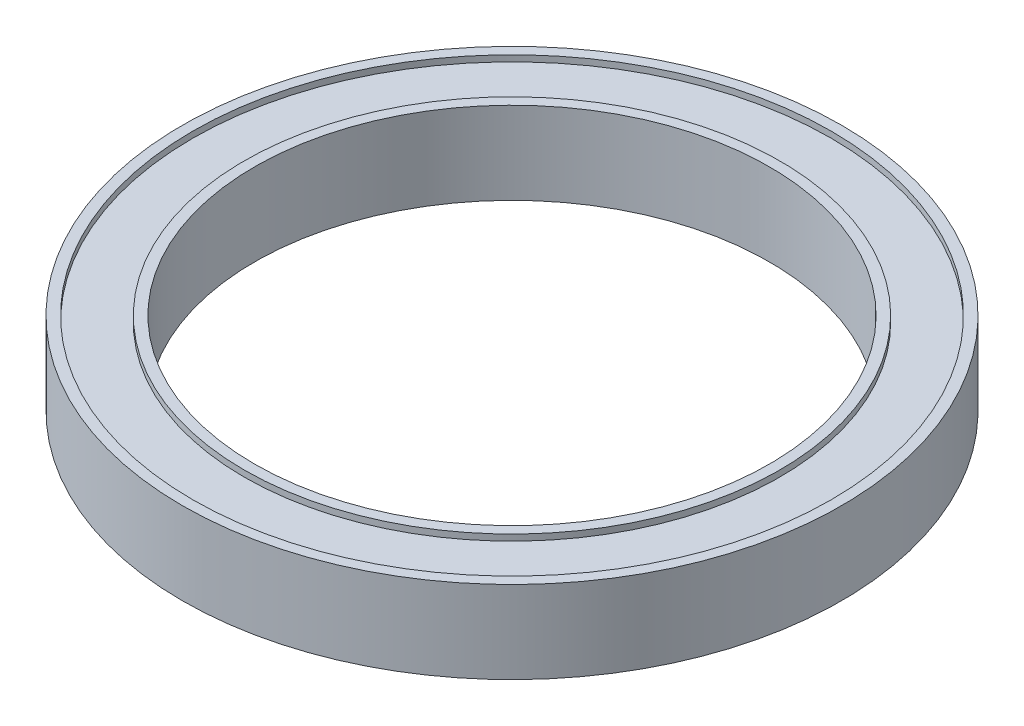
ISO-10303-21;
HEADER;
FILE_DESCRIPTION(('STEP AP214'),'2;1');
FILE_NAME('part.step','',(''),(''),'','','');
FILE_SCHEMA(('AUTOMOTIVE_DESIGN { 1 0 10303 214 1 1 1 1 }'));
ENDSEC;
DATA;
#1=APPLICATION_CONTEXT('core data for automotive mechanical design processes');
#2=APPLICATION_PROTOCOL_DEFINITION('international standard','automotive_design',2000,#1);
#3=PRODUCT_CONTEXT('',#1,'mechanical');
#4=PRODUCT('Part','Part','',(#3));
#5=PRODUCT_RELATED_PRODUCT_CATEGORY('part','',(#4));
#6=PRODUCT_DEFINITION_FORMATION('','',#4);
#7=PRODUCT_DEFINITION_CONTEXT('part definition',#1,'design');
#8=PRODUCT_DEFINITION('design','',#6,#7);
#9=PRODUCT_DEFINITION_SHAPE('','',#8);
#10=(LENGTH_UNIT() NAMED_UNIT(*) SI_UNIT(.MILLI.,.METRE.));
#11=(NAMED_UNIT(*) PLANE_ANGLE_UNIT() SI_UNIT($,.RADIAN.));
#12=(NAMED_UNIT(*) SI_UNIT($,.STERADIAN.) SOLID_ANGLE_UNIT());
#13=UNCERTAINTY_MEASURE_WITH_UNIT(LENGTH_MEASURE(1.E-05),#10,'distance_accuracy_value','');
#14=(GEOMETRIC_REPRESENTATION_CONTEXT(3) GLOBAL_UNCERTAINTY_ASSIGNED_CONTEXT((#13)) GLOBAL_UNIT_ASSIGNED_CONTEXT((#10,
#11,#12)) REPRESENTATION_CONTEXT('',''));
#15=CARTESIAN_POINT('',(0.,0.,0.));
#16=DIRECTION('',(0.,0.,1.));
#17=DIRECTION('',(1.,0.,0.));
#18=AXIS2_PLACEMENT_3D('',#15,#16,#17);
#19=CARTESIAN_POINT('',(0.,0.,0.));
#20=DIRECTION('',(0.,1.,0.));
#21=DIRECTION('',(0.,0.,1.));
#22=AXIS2_PLACEMENT_3D('',#19,#20,#21);
#23=PLANE('',#22);
#24=CARTESIAN_POINT('',(0.,0.,0.));
#25=DIRECTION('',(0.,1.,0.));
#26=DIRECTION('',(0.,0.,1.));
#27=AXIS2_PLACEMENT_3D('',#24,#25,#26);
#28=CIRCLE('',#27,12.5);
#29=CARTESIAN_POINT('',(0.,0.,12.5));
#30=VERTEX_POINT('',#29);
#31=EDGE_CURVE('E52',#30,#30,#28,.T.);
#32=ORIENTED_EDGE('',*,*,#31,.T.);
#33=EDGE_LOOP('',(#32));
#34=FACE_BOUND('',#33,.T.);
#35=CARTESIAN_POINT('',(0.,0.,0.));
#36=DIRECTION('',(0.,1.,0.));
#37=DIRECTION('',(0.,0.,1.));
#38=AXIS2_PLACEMENT_3D('',#35,#36,#37);
#39=CIRCLE('',#38,13.);
#40=CARTESIAN_POINT('',(0.,0.,13.));
#41=VERTEX_POINT('',#40);
#42=EDGE_CURVE('E76',#41,#41,#39,.T.);
#43=ORIENTED_EDGE('',*,*,#42,.F.);
#44=EDGE_LOOP('',(#43));
#45=FACE_BOUND('',#44,.T.);
#46=ADVANCED_FACE('F39',(#34,#45),#23,.F.);
#47=CARTESIAN_POINT('',(0.,4.,0.));
#48=DIRECTION('',(0.,1.,0.));
#49=DIRECTION('',(0.,0.,1.));
#50=AXIS2_PLACEMENT_3D('',#47,#48,#49);
#51=PLANE('',#50);
#52=CARTESIAN_POINT('',(0.,4.,0.));
#53=DIRECTION('',(0.,1.,0.));
#54=DIRECTION('',(0.,0.,1.));
#55=AXIS2_PLACEMENT_3D('',#52,#53,#54);
#56=CIRCLE('',#55,12.5);
#57=CARTESIAN_POINT('',(0.,4.,12.5));
#58=VERTEX_POINT('',#57);
#59=EDGE_CURVE('E50',#58,#58,#56,.T.);
#60=ORIENTED_EDGE('',*,*,#59,.F.);
#61=EDGE_LOOP('',(#60));
#62=FACE_BOUND('',#61,.T.);
#63=CARTESIAN_POINT('',(0.,4.,0.));
#64=DIRECTION('',(0.,1.,0.));
#65=DIRECTION('',(0.,0.,1.));
#66=AXIS2_PLACEMENT_3D('',#63,#64,#65);
#67=CIRCLE('',#66,13.);
#68=CARTESIAN_POINT('',(0.,4.,13.));
#69=VERTEX_POINT('',#68);
#70=EDGE_CURVE('E64',#69,#69,#67,.T.);
#71=ORIENTED_EDGE('',*,*,#70,.T.);
#72=EDGE_LOOP('',(#71));
#73=FACE_BOUND('',#72,.T.);
#74=ADVANCED_FACE('F92',(#62,#73),#51,.T.);
#75=CARTESIAN_POINT('',(0.,4.,0.));
#76=DIRECTION('',(0.,1.,0.));
#77=DIRECTION('',(0.,0.,1.));
#78=AXIS2_PLACEMENT_3D('',#75,#76,#77);
#79=CIRCLE('',#78,15.5);
#80=CARTESIAN_POINT('',(0.,4.,15.5));
#81=VERTEX_POINT('',#80);
#82=EDGE_CURVE('E58',#81,#81,#79,.T.);
#83=ORIENTED_EDGE('',*,*,#82,.F.);
#84=EDGE_LOOP('',(#83));
#85=FACE_BOUND('',#84,.T.);
#86=CARTESIAN_POINT('',(0.,4.,0.));
#87=DIRECTION('',(0.,1.,0.));
#88=DIRECTION('',(0.,0.,1.));
#89=AXIS2_PLACEMENT_3D('',#86,#87,#88);
#90=CIRCLE('',#89,16.);
#91=CARTESIAN_POINT('',(0.,4.,16.));
#92=VERTEX_POINT('',#91);
#93=EDGE_CURVE('E10',#92,#92,#90,.T.);
#94=ORIENTED_EDGE('',*,*,#93,.T.);
#95=EDGE_LOOP('',(#94));
#96=FACE_BOUND('',#95,.T.);
#97=ADVANCED_FACE('F100',(#85,#96),#51,.T.);
#98=CARTESIAN_POINT('',(0.,0.,0.));
#99=DIRECTION('',(0.,1.,0.));
#100=DIRECTION('',(0.,0.,1.));
#101=AXIS2_PLACEMENT_3D('',#98,#99,#100);
#102=CIRCLE('',#101,15.5);
#103=CARTESIAN_POINT('',(0.,0.,15.5));
#104=VERTEX_POINT('',#103);
#105=EDGE_CURVE('E70',#104,#104,#102,.T.);
#106=ORIENTED_EDGE('',*,*,#105,.T.);
#107=EDGE_LOOP('',(#106));
#108=FACE_BOUND('',#107,.T.);
#109=CARTESIAN_POINT('',(0.,0.,0.));
#110=DIRECTION('',(0.,1.,0.));
#111=DIRECTION('',(0.,0.,1.));
#112=AXIS2_PLACEMENT_3D('',#109,#110,#111);
#113=CIRCLE('',#112,16.);
#114=CARTESIAN_POINT('',(0.,0.,16.));
#115=VERTEX_POINT('',#114);
#116=EDGE_CURVE('E43',#115,#115,#113,.T.);
#117=ORIENTED_EDGE('',*,*,#116,.F.);
#118=EDGE_LOOP('',(#117));
#119=FACE_BOUND('',#118,.T.);
#120=ADVANCED_FACE('F94',(#108,#119),#23,.F.);
#121=CARTESIAN_POINT('',(0.,4.,0.));
#122=DIRECTION('',(0.,-1.,0.));
#123=DIRECTION('',(0.,0.,-1.));
#124=AXIS2_PLACEMENT_3D('',#121,#122,#123);
#125=CYLINDRICAL_SURFACE('',#124,16.);
#126=ORIENTED_EDGE('',*,*,#93,.F.);
#127=EDGE_LOOP('',(#126));
#128=FACE_BOUND('',#127,.T.);
#129=ORIENTED_EDGE('',*,*,#116,.T.);
#130=EDGE_LOOP('',(#129));
#131=FACE_BOUND('',#130,.T.);
#132=ADVANCED_FACE('F41',(#128,#131),#125,.T.);
#133=CARTESIAN_POINT('',(0.,4.,0.));
#134=DIRECTION('',(0.,-1.,0.));
#135=DIRECTION('',(0.,0.,-1.));
#136=AXIS2_PLACEMENT_3D('',#133,#134,#135);
#137=CYLINDRICAL_SURFACE('',#136,12.5);
#138=ORIENTED_EDGE('',*,*,#59,.T.);
#139=EDGE_LOOP('',(#138));
#140=FACE_BOUND('',#139,.T.);
#141=ORIENTED_EDGE('',*,*,#31,.F.);
#142=EDGE_LOOP('',(#141));
#143=FACE_BOUND('',#142,.T.);
#144=ADVANCED_FACE('F108',(#140,#143),#137,.F.);
#145=CARTESIAN_POINT('',(0.,3.7,0.));
#146=DIRECTION('',(0.,1.,0.));
#147=DIRECTION('',(0.,0.,1.));
#148=AXIS2_PLACEMENT_3D('',#145,#146,#147);
#149=CYLINDRICAL_SURFACE('',#148,15.5);
#150=CARTESIAN_POINT('',(0.,3.7,0.));
#151=DIRECTION('',(0.,1.,0.));
#152=DIRECTION('',(0.,0.,1.));
#153=AXIS2_PLACEMENT_3D('',#150,#151,#152);
#154=CIRCLE('',#153,15.5);
#155=CARTESIAN_POINT('',(0.,3.7,15.5));
#156=VERTEX_POINT('',#155);
#157=EDGE_CURVE('E55',#156,#156,#154,.T.);
#158=ORIENTED_EDGE('',*,*,#157,.F.);
#159=EDGE_LOOP('',(#158));
#160=FACE_BOUND('',#159,.T.);
#161=ORIENTED_EDGE('',*,*,#82,.T.);
#162=EDGE_LOOP('',(#161));
#163=FACE_BOUND('',#162,.T.);
#164=ADVANCED_FACE('F131',(#160,#163),#149,.F.);
#165=CARTESIAN_POINT('',(0.,3.7,0.));
#166=DIRECTION('',(0.,1.,0.));
#167=DIRECTION('',(0.,0.,1.));
#168=AXIS2_PLACEMENT_3D('',#165,#166,#167);
#169=PLANE('',#168);
#170=CARTESIAN_POINT('',(0.,3.7,0.));
#171=DIRECTION('',(0.,1.,0.));
#172=DIRECTION('',(0.,0.,1.));
#173=AXIS2_PLACEMENT_3D('',#170,#171,#172);
#174=CIRCLE('',#173,13.);
#175=CARTESIAN_POINT('',(0.,3.7,13.));
#176=VERTEX_POINT('',#175);
#177=EDGE_CURVE('E61',#176,#176,#174,.T.);
#178=ORIENTED_EDGE('',*,*,#177,.F.);
#179=EDGE_LOOP('',(#178));
#180=FACE_BOUND('',#179,.T.);
#181=ORIENTED_EDGE('',*,*,#157,.T.);
#182=EDGE_LOOP('',(#181));
#183=FACE_BOUND('',#182,.T.);
#184=ADVANCED_FACE('F127',(#180,#183),#169,.T.);
#185=CARTESIAN_POINT('',(0.,3.7,0.));
#186=DIRECTION('',(0.,1.,0.));
#187=DIRECTION('',(0.,0.,1.));
#188=AXIS2_PLACEMENT_3D('',#185,#186,#187);
#189=CYLINDRICAL_SURFACE('',#188,13.);
#190=ORIENTED_EDGE('',*,*,#177,.T.);
#191=EDGE_LOOP('',(#190));
#192=FACE_BOUND('',#191,.T.);
#193=ORIENTED_EDGE('',*,*,#70,.F.);
#194=EDGE_LOOP('',(#193));
#195=FACE_BOUND('',#194,.T.);
#196=ADVANCED_FACE('F122',(#192,#195),#189,.T.);
#197=CARTESIAN_POINT('',(0.,0.3,0.));
#198=DIRECTION('',(0.,-1.,0.));
#199=DIRECTION('',(0.,0.,1.));
#200=AXIS2_PLACEMENT_3D('',#197,#198,#199);
#201=PLANE('',#200);
#202=CARTESIAN_POINT('',(0.,0.3,0.));
#203=DIRECTION('',(0.,1.,0.));
#204=DIRECTION('',(0.,0.,1.));
#205=AXIS2_PLACEMENT_3D('',#202,#203,#204);
#206=CIRCLE('',#205,15.5);
#207=CARTESIAN_POINT('',(0.,0.3,15.5));
#208=VERTEX_POINT('',#207);
#209=EDGE_CURVE('E67',#208,#208,#206,.T.);
#210=ORIENTED_EDGE('',*,*,#209,.F.);
#211=EDGE_LOOP('',(#210));
#212=FACE_BOUND('',#211,.T.);
#213=CARTESIAN_POINT('',(0.,0.3,0.));
#214=DIRECTION('',(0.,1.,0.));
#215=DIRECTION('',(0.,0.,1.));
#216=AXIS2_PLACEMENT_3D('',#213,#214,#215);
#217=CIRCLE('',#216,13.);
#218=CARTESIAN_POINT('',(0.,0.3,13.));
#219=VERTEX_POINT('',#218);
#220=EDGE_CURVE('E73',#219,#219,#217,.T.);
#221=ORIENTED_EDGE('',*,*,#220,.T.);
#222=EDGE_LOOP('',(#221));
#223=FACE_BOUND('',#222,.T.);
#224=ADVANCED_FACE('F82',(#212,#223),#201,.T.);
#225=CARTESIAN_POINT('',(0.,0.3,0.));
#226=DIRECTION('',(0.,-1.,0.));
#227=DIRECTION('',(0.,0.,-1.));
#228=AXIS2_PLACEMENT_3D('',#225,#226,#227);
#229=CYLINDRICAL_SURFACE('',#228,15.5);
#230=ORIENTED_EDGE('',*,*,#209,.T.);
#231=EDGE_LOOP('',(#230));
#232=FACE_BOUND('',#231,.T.);
#233=ORIENTED_EDGE('',*,*,#105,.F.);
#234=EDGE_LOOP('',(#233));
#235=FACE_BOUND('',#234,.T.);
#236=ADVANCED_FACE('F87',(#232,#235),#229,.F.);
#237=CARTESIAN_POINT('',(0.,0.3,0.));
#238=DIRECTION('',(0.,-1.,0.));
#239=DIRECTION('',(0.,0.,-1.));
#240=AXIS2_PLACEMENT_3D('',#237,#238,#239);
#241=CYLINDRICAL_SURFACE('',#240,13.);
#242=ORIENTED_EDGE('',*,*,#220,.F.);
#243=EDGE_LOOP('',(#242));
#244=FACE_BOUND('',#243,.T.);
#245=ORIENTED_EDGE('',*,*,#42,.T.);
#246=EDGE_LOOP('',(#245));
#247=FACE_BOUND('',#246,.T.);
#248=ADVANCED_FACE('F84',(#244,#247),#241,.T.);
#249=CLOSED_SHELL('',(#46,#74,#97,#120,#132,#144,#164,#184,#196,#224,#236,#248));
#250=MANIFOLD_SOLID_BREP('B2',#249);
#251=ADVANCED_BREP_SHAPE_REPRESENTATION('',(#18,#250),#14);
#252=SHAPE_DEFINITION_REPRESENTATION(#9,#251);
ENDSEC;
END-ISO-10303-21;
